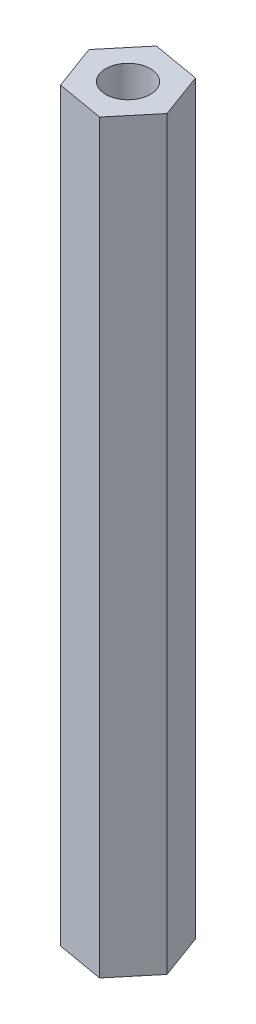
ISO-10303-21;
HEADER;
FILE_DESCRIPTION(('STEP AP214'),'2;1');
FILE_NAME('part.step','',(''),(''),'','','');
FILE_SCHEMA(('AUTOMOTIVE_DESIGN { 1 0 10303 214 1 1 1 1 }'));
ENDSEC;
DATA;
#1=APPLICATION_CONTEXT('core data for automotive mechanical design processes');
#2=APPLICATION_PROTOCOL_DEFINITION('international standard','automotive_design',2000,#1);
#3=PRODUCT_CONTEXT('',#1,'mechanical');
#4=PRODUCT('Part','Part','',(#3));
#5=PRODUCT_RELATED_PRODUCT_CATEGORY('part','',(#4));
#6=PRODUCT_DEFINITION_FORMATION('','',#4);
#7=PRODUCT_DEFINITION_CONTEXT('part definition',#1,'design');
#8=PRODUCT_DEFINITION('design','',#6,#7);
#9=PRODUCT_DEFINITION_SHAPE('','',#8);
#10=(LENGTH_UNIT() NAMED_UNIT(*) SI_UNIT(.MILLI.,.METRE.));
#11=(NAMED_UNIT(*) PLANE_ANGLE_UNIT() SI_UNIT($,.RADIAN.));
#12=(NAMED_UNIT(*) SI_UNIT($,.STERADIAN.) SOLID_ANGLE_UNIT());
#13=UNCERTAINTY_MEASURE_WITH_UNIT(LENGTH_MEASURE(1.E-05),#10,'distance_accuracy_value','');
#14=(GEOMETRIC_REPRESENTATION_CONTEXT(3) GLOBAL_UNCERTAINTY_ASSIGNED_CONTEXT((#13)) GLOBAL_UNIT_ASSIGNED_CONTEXT((#10,
#11,#12)) REPRESENTATION_CONTEXT('',''));
#15=CARTESIAN_POINT('',(0.,0.,0.));
#16=DIRECTION('',(0.,0.,1.));
#17=DIRECTION('',(1.,0.,0.));
#18=AXIS2_PLACEMENT_3D('',#15,#16,#17);
#19=CARTESIAN_POINT('',(0.,50.,0.));
#20=DIRECTION('',(0.,1.,0.));
#21=DIRECTION('',(0.,0.,1.));
#22=AXIS2_PLACEMENT_3D('',#19,#20,#21);
#23=PLANE('',#22);
#24=DIRECTION('',(0.985494120976988,0.,0.169709568144505));
#25=VECTOR('',#24,1.);
#26=CARTESIAN_POINT('',(-2.05624239989983,50.,2.47052622846547));
#27=LINE('',#26,#25);
#28=CARTESIAN_POINT('',(-2.05624239989983,50.,2.47052622846547));
#29=VERTEX_POINT('',#28);
#30=CARTESIAN_POINT('',(1.11141727466937,50.,3.01602126893));
#31=VERTEX_POINT('',#30);
#32=EDGE_CURVE('E146',#29,#31,#27,.T.);
#33=ORIENTED_EDGE('',*,*,#32,.T.);
#34=DIRECTION('',(0.639719857783097,0.,-0.768608159960571));
#35=VECTOR('',#34,1.);
#36=CARTESIAN_POINT('',(1.11141727466937,50.,3.01602126893));
#37=LINE('',#36,#35);
#38=CARTESIAN_POINT('',(3.16765967459966,50.,0.545495040589612));
#39=VERTEX_POINT('',#38);
#40=EDGE_CURVE('E94',#31,#39,#37,.T.);
#41=ORIENTED_EDGE('',*,*,#40,.T.);
#42=DIRECTION('',(-0.345774263225589,0.,-0.938317728112818));
#43=VECTOR('',#42,1.);
#44=CARTESIAN_POINT('',(3.16765967459966,50.,0.545495040589612));
#45=LINE('',#44,#43);
#46=CARTESIAN_POINT('',(2.05624239989944,50.,-2.47052622847075));
#47=VERTEX_POINT('',#46);
#48=EDGE_CURVE('E107',#39,#47,#45,.T.);
#49=ORIENTED_EDGE('',*,*,#48,.T.);
#50=DIRECTION('',(-0.985494120976988,0.,-0.169709568144504));
#51=VECTOR('',#50,1.);
#52=CARTESIAN_POINT('',(2.05624239989944,50.,-2.47052622847075));
#53=LINE('',#52,#51);
#54=CARTESIAN_POINT('',(-1.11141727460843,50.,-3.01602126892472));
#55=VERTEX_POINT('',#54);
#56=EDGE_CURVE('E101',#47,#55,#53,.T.);
#57=ORIENTED_EDGE('',*,*,#56,.T.);
#58=DIRECTION('',(-0.639719857776031,0.,0.768608159966451));
#59=VECTOR('',#58,1.);
#60=CARTESIAN_POINT('',(-1.11141727460843,50.,-3.01602126892472));
#61=LINE('',#60,#59);
#62=CARTESIAN_POINT('',(-3.16765967459978,50.,-0.545495040464771));
#63=VERTEX_POINT('',#62);
#64=EDGE_CURVE('E105',#55,#63,#61,.T.);
#65=ORIENTED_EDGE('',*,*,#64,.T.);
#66=DIRECTION('',(0.345774263238647,0.,0.938317728108007));
#67=VECTOR('',#66,1.);
#68=CARTESIAN_POINT('',(-3.16765967459978,50.,-0.545495040464771));
#69=LINE('',#68,#67);
#70=EDGE_CURVE('E57',#63,#29,#69,.T.);
#71=ORIENTED_EDGE('',*,*,#70,.T.);
#72=EDGE_LOOP('',(#33,#41,#49,#57,#65,#71));
#73=FACE_BOUND('',#72,.T.);
#74=CARTESIAN_POINT('',(-3.16413562017876E-11,50.,-2.37904933848027E-13));
#75=DIRECTION('',(0.,1.,0.));
#76=DIRECTION('',(0.,0.,1.));
#77=AXIS2_PLACEMENT_3D('',#74,#75,#76);
#78=CIRCLE('',#77,1.5);
#79=CARTESIAN_POINT('',(-3.16413562017876E-11,50.,1.49999999999976));
#80=VERTEX_POINT('',#79);
#81=EDGE_CURVE('E134',#80,#80,#78,.T.);
#82=ORIENTED_EDGE('',*,*,#81,.F.);
#83=EDGE_LOOP('',(#82));
#84=FACE_BOUND('',#83,.T.);
#85=ADVANCED_FACE('F39',(#73,#84),#23,.T.);
#86=CARTESIAN_POINT('',(0.,0.,0.));
#87=DIRECTION('',(0.,1.,0.));
#88=DIRECTION('',(0.,0.,1.));
#89=AXIS2_PLACEMENT_3D('',#86,#87,#88);
#90=PLANE('',#89);
#91=DIRECTION('',(0.985494120976988,0.,0.169709568144505));
#92=VECTOR('',#91,1.);
#93=CARTESIAN_POINT('',(-2.05624239989983,0.,2.47052622846547));
#94=LINE('',#93,#92);
#95=CARTESIAN_POINT('',(-2.05624239989983,0.,2.47052622846547));
#96=VERTEX_POINT('',#95);
#97=CARTESIAN_POINT('',(1.11141727466937,0.,3.01602126893));
#98=VERTEX_POINT('',#97);
#99=EDGE_CURVE('E129',#96,#98,#94,.T.);
#100=ORIENTED_EDGE('',*,*,#99,.F.);
#101=DIRECTION('',(0.345774263238647,0.,0.938317728108007));
#102=VECTOR('',#101,1.);
#103=CARTESIAN_POINT('',(-3.16765967459978,0.,-0.545495040464771));
#104=LINE('',#103,#102);
#105=CARTESIAN_POINT('',(-3.16765967459978,0.,-0.545495040464771));
#106=VERTEX_POINT('',#105);
#107=EDGE_CURVE('E86',#106,#96,#104,.T.);
#108=ORIENTED_EDGE('',*,*,#107,.F.);
#109=DIRECTION('',(-0.639719857776031,0.,0.768608159966451));
#110=VECTOR('',#109,1.);
#111=CARTESIAN_POINT('',(-1.11141727460843,0.,-3.01602126892472));
#112=LINE('',#111,#110);
#113=CARTESIAN_POINT('',(-1.11141727460843,0.,-3.01602126892472));
#114=VERTEX_POINT('',#113);
#115=EDGE_CURVE('E80',#114,#106,#112,.T.);
#116=ORIENTED_EDGE('',*,*,#115,.F.);
#117=DIRECTION('',(-0.985494120976988,0.,-0.169709568144504));
#118=VECTOR('',#117,1.);
#119=CARTESIAN_POINT('',(2.05624239989944,0.,-2.47052622847075));
#120=LINE('',#119,#118);
#121=CARTESIAN_POINT('',(2.05624239989944,0.,-2.47052622847075));
#122=VERTEX_POINT('',#121);
#123=EDGE_CURVE('E116',#122,#114,#120,.T.);
#124=ORIENTED_EDGE('',*,*,#123,.F.);
#125=DIRECTION('',(-0.345774263225589,0.,-0.938317728112818));
#126=VECTOR('',#125,1.);
#127=CARTESIAN_POINT('',(3.16765967459966,0.,0.545495040589612));
#128=LINE('',#127,#126);
#129=CARTESIAN_POINT('',(3.16765967459966,0.,0.545495040589612));
#130=VERTEX_POINT('',#129);
#131=EDGE_CURVE('E137',#130,#122,#128,.T.);
#132=ORIENTED_EDGE('',*,*,#131,.F.);
#133=DIRECTION('',(0.639719857783097,0.,-0.768608159960571));
#134=VECTOR('',#133,1.);
#135=CARTESIAN_POINT('',(1.11141727466937,0.,3.01602126893));
#136=LINE('',#135,#134);
#137=EDGE_CURVE('E133',#98,#130,#136,.T.);
#138=ORIENTED_EDGE('',*,*,#137,.F.);
#139=EDGE_LOOP('',(#100,#108,#116,#124,#132,#138));
#140=FACE_BOUND('',#139,.T.);
#141=CARTESIAN_POINT('',(-3.16413562017876E-11,0.,-2.37904933848027E-13));
#142=DIRECTION('',(0.,1.,0.));
#143=DIRECTION('',(0.,0.,1.));
#144=AXIS2_PLACEMENT_3D('',#141,#142,#143);
#145=CIRCLE('',#144,1.5);
#146=CARTESIAN_POINT('',(-3.16413562017876E-11,0.,1.49999999999976));
#147=VERTEX_POINT('',#146);
#148=EDGE_CURVE('E243',#147,#147,#145,.T.);
#149=ORIENTED_EDGE('',*,*,#148,.T.);
#150=EDGE_LOOP('',(#149));
#151=FACE_BOUND('',#150,.T.);
#152=ADVANCED_FACE('F159',(#140,#151),#90,.F.);
#153=CARTESIAN_POINT('',(-2.05624239989983,50.,2.47052622846547));
#154=DIRECTION('',(0.169709568144505,0.,-0.985494120976988));
#155=DIRECTION('',(-0.985494120976988,0.,-0.169709568144505));
#156=AXIS2_PLACEMENT_3D('',#153,#154,#155);
#157=PLANE('',#156);
#158=ORIENTED_EDGE('',*,*,#99,.T.);
#159=DIRECTION('',(0.,-1.,0.));
#160=VECTOR('',#159,1.);
#161=CARTESIAN_POINT('',(1.11141727466937,50.,3.01602126893));
#162=LINE('',#161,#160);
#163=EDGE_CURVE('E11',#31,#98,#162,.T.);
#164=ORIENTED_EDGE('',*,*,#163,.F.);
#165=ORIENTED_EDGE('',*,*,#32,.F.);
#166=DIRECTION('',(0.,-1.,0.));
#167=VECTOR('',#166,1.);
#168=CARTESIAN_POINT('',(-2.05624239989983,50.,2.47052622846547));
#169=LINE('',#168,#167);
#170=EDGE_CURVE('E125',#29,#96,#169,.T.);
#171=ORIENTED_EDGE('',*,*,#170,.T.);
#172=EDGE_LOOP('',(#158,#164,#165,#171));
#173=FACE_BOUND('',#172,.T.);
#174=ADVANCED_FACE('F41',(#173),#157,.F.);
#175=CARTESIAN_POINT('',(1.11141727466937,50.,3.01602126893));
#176=DIRECTION('',(-0.768608159960571,0.,-0.639719857783097));
#177=DIRECTION('',(-0.639719857783097,0.,0.768608159960571));
#178=AXIS2_PLACEMENT_3D('',#175,#176,#177);
#179=PLANE('',#178);
#180=ORIENTED_EDGE('',*,*,#137,.T.);
#181=DIRECTION('',(0.,-1.,0.));
#182=VECTOR('',#181,1.);
#183=CARTESIAN_POINT('',(3.16765967459966,50.,0.545495040589612));
#184=LINE('',#183,#182);
#185=EDGE_CURVE('E49',#39,#130,#184,.T.);
#186=ORIENTED_EDGE('',*,*,#185,.F.);
#187=ORIENTED_EDGE('',*,*,#40,.F.);
#188=ORIENTED_EDGE('',*,*,#163,.T.);
#189=EDGE_LOOP('',(#180,#186,#187,#188));
#190=FACE_BOUND('',#189,.T.);
#191=ADVANCED_FACE('F184',(#190),#179,.F.);
#192=CARTESIAN_POINT('',(3.16765967459966,50.,0.545495040589612));
#193=DIRECTION('',(-0.938317728112819,0.,0.345774263225589));
#194=DIRECTION('',(0.345774263225589,0.,0.938317728112819));
#195=AXIS2_PLACEMENT_3D('',#192,#193,#194);
#196=PLANE('',#195);
#197=ORIENTED_EDGE('',*,*,#131,.T.);
#198=DIRECTION('',(0.,-1.,0.));
#199=VECTOR('',#198,1.);
#200=CARTESIAN_POINT('',(2.05624239989944,50.,-2.47052622847075));
#201=LINE('',#200,#199);
#202=EDGE_CURVE('E118',#47,#122,#201,.T.);
#203=ORIENTED_EDGE('',*,*,#202,.F.);
#204=ORIENTED_EDGE('',*,*,#48,.F.);
#205=ORIENTED_EDGE('',*,*,#185,.T.);
#206=EDGE_LOOP('',(#197,#203,#204,#205));
#207=FACE_BOUND('',#206,.T.);
#208=ADVANCED_FACE('F156',(#207),#196,.F.);
#209=CARTESIAN_POINT('',(2.05624239989944,50.,-2.47052622847075));
#210=DIRECTION('',(-0.169709568144504,0.,0.985494120976988));
#211=DIRECTION('',(0.985494120976988,0.,0.169709568144504));
#212=AXIS2_PLACEMENT_3D('',#209,#210,#211);
#213=PLANE('',#212);
#214=ORIENTED_EDGE('',*,*,#123,.T.);
#215=DIRECTION('',(0.,-1.,0.));
#216=VECTOR('',#215,1.);
#217=CARTESIAN_POINT('',(-1.11141727460843,50.,-3.01602126892472));
#218=LINE('',#217,#216);
#219=EDGE_CURVE('E113',#55,#114,#218,.T.);
#220=ORIENTED_EDGE('',*,*,#219,.F.);
#221=ORIENTED_EDGE('',*,*,#56,.F.);
#222=ORIENTED_EDGE('',*,*,#202,.T.);
#223=EDGE_LOOP('',(#214,#220,#221,#222));
#224=FACE_BOUND('',#223,.T.);
#225=ADVANCED_FACE('F114',(#224),#213,.F.);
#226=CARTESIAN_POINT('',(-1.11141727460843,50.,-3.01602126892472));
#227=DIRECTION('',(0.768608159966452,0.,0.639719857776031));
#228=DIRECTION('',(0.639719857776031,0.,-0.768608159966451));
#229=AXIS2_PLACEMENT_3D('',#226,#227,#228);
#230=PLANE('',#229);
#231=ORIENTED_EDGE('',*,*,#115,.T.);
#232=DIRECTION('',(0.,-1.,0.));
#233=VECTOR('',#232,1.);
#234=CARTESIAN_POINT('',(-3.16765967459978,50.,-0.545495040464771));
#235=LINE('',#234,#233);
#236=EDGE_CURVE('E119',#63,#106,#235,.T.);
#237=ORIENTED_EDGE('',*,*,#236,.F.);
#238=ORIENTED_EDGE('',*,*,#64,.F.);
#239=ORIENTED_EDGE('',*,*,#219,.T.);
#240=EDGE_LOOP('',(#231,#237,#238,#239));
#241=FACE_BOUND('',#240,.T.);
#242=ADVANCED_FACE('F121',(#241),#230,.F.);
#243=CARTESIAN_POINT('',(-3.16765967459978,50.,-0.545495040464771));
#244=DIRECTION('',(0.938317728108007,0.,-0.345774263238647));
#245=DIRECTION('',(-0.345774263238647,0.,-0.938317728108007));
#246=AXIS2_PLACEMENT_3D('',#243,#244,#245);
#247=PLANE('',#246);
#248=ORIENTED_EDGE('',*,*,#107,.T.);
#249=ORIENTED_EDGE('',*,*,#170,.F.);
#250=ORIENTED_EDGE('',*,*,#70,.F.);
#251=ORIENTED_EDGE('',*,*,#236,.T.);
#252=EDGE_LOOP('',(#248,#249,#250,#251));
#253=FACE_BOUND('',#252,.T.);
#254=ADVANCED_FACE('F164',(#253),#247,.F.);
#255=CARTESIAN_POINT('',(-3.16413562017876E-11,50.,-2.37904933848027E-13));
#256=DIRECTION('',(0.,-1.,0.));
#257=DIRECTION('',(0.,0.,-1.));
#258=AXIS2_PLACEMENT_3D('',#255,#256,#257);
#259=CYLINDRICAL_SURFACE('',#258,1.5);
#260=ORIENTED_EDGE('',*,*,#81,.T.);
#261=EDGE_LOOP('',(#260));
#262=FACE_BOUND('',#261,.T.);
#263=ORIENTED_EDGE('',*,*,#148,.F.);
#264=EDGE_LOOP('',(#263));
#265=FACE_BOUND('',#264,.T.);
#266=ADVANCED_FACE('F166',(#262,#265),#259,.F.);
#267=CLOSED_SHELL('',(#85,#152,#174,#191,#208,#225,#242,#254,#266));
#268=MANIFOLD_SOLID_BREP('B2',#267);
#269=ADVANCED_BREP_SHAPE_REPRESENTATION('',(#18,#268),#14);
#270=SHAPE_DEFINITION_REPRESENTATION(#9,#269);
ENDSEC;
END-ISO-10303-21;
